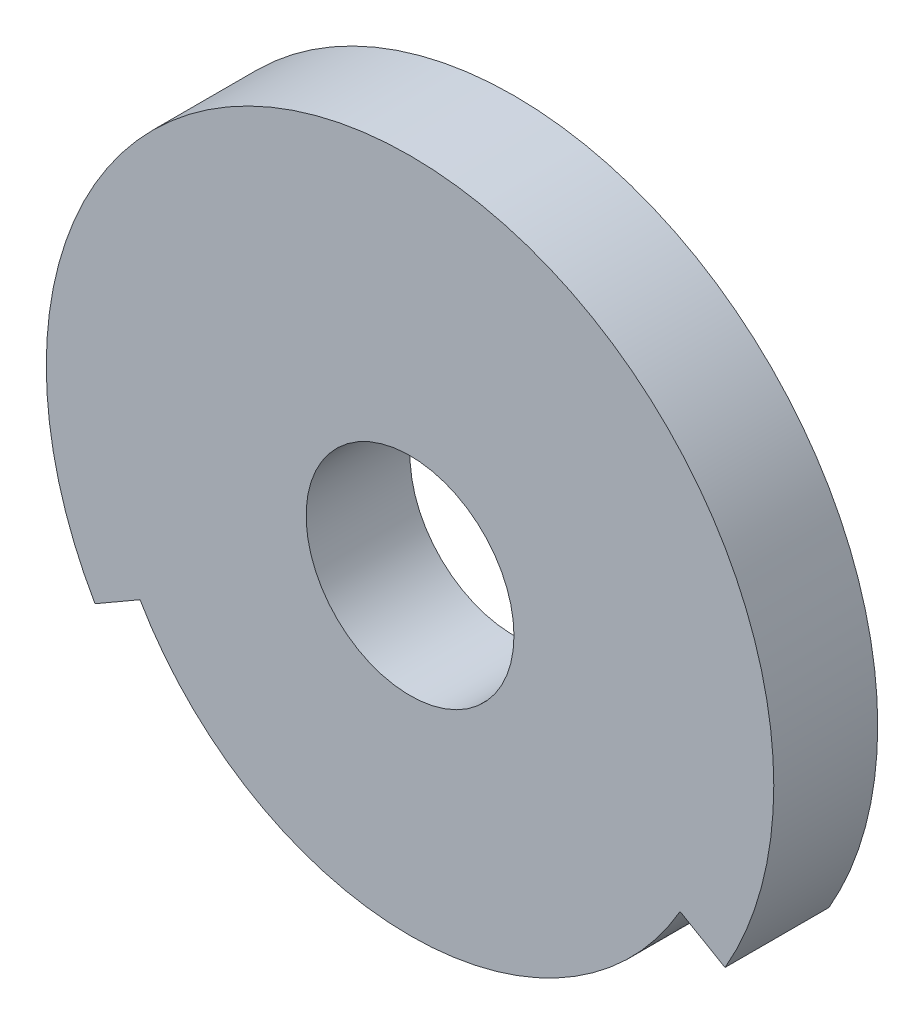
ISO-10303-21;
HEADER;
FILE_DESCRIPTION(('STEP AP214'),'2;1');
FILE_NAME('part.step','',(''),(''),'','','');
FILE_SCHEMA(('AUTOMOTIVE_DESIGN { 1 0 10303 214 1 1 1 1 }'));
ENDSEC;
DATA;
#1=APPLICATION_CONTEXT('core data for automotive mechanical design processes');
#2=APPLICATION_PROTOCOL_DEFINITION('international standard','automotive_design',2000,#1);
#3=PRODUCT_CONTEXT('',#1,'mechanical');
#4=PRODUCT('Part','Part','',(#3));
#5=PRODUCT_RELATED_PRODUCT_CATEGORY('part','',(#4));
#6=PRODUCT_DEFINITION_FORMATION('','',#4);
#7=PRODUCT_DEFINITION_CONTEXT('part definition',#1,'design');
#8=PRODUCT_DEFINITION('design','',#6,#7);
#9=PRODUCT_DEFINITION_SHAPE('','',#8);
#10=(LENGTH_UNIT() NAMED_UNIT(*) SI_UNIT(.MILLI.,.METRE.));
#11=(NAMED_UNIT(*) PLANE_ANGLE_UNIT() SI_UNIT($,.RADIAN.));
#12=(NAMED_UNIT(*) SI_UNIT($,.STERADIAN.) SOLID_ANGLE_UNIT());
#13=UNCERTAINTY_MEASURE_WITH_UNIT(LENGTH_MEASURE(1.E-05),#10,'distance_accuracy_value','');
#14=(GEOMETRIC_REPRESENTATION_CONTEXT(3) GLOBAL_UNCERTAINTY_ASSIGNED_CONTEXT((#13)) GLOBAL_UNIT_ASSIGNED_CONTEXT((#10,
#11,#12)) REPRESENTATION_CONTEXT('',''));
#15=CARTESIAN_POINT('',(0.,0.,0.));
#16=DIRECTION('',(0.,0.,1.));
#17=DIRECTION('',(1.,0.,0.));
#18=AXIS2_PLACEMENT_3D('',#15,#16,#17);
#19=CARTESIAN_POINT('',(0.,0.,1.));
#20=DIRECTION('',(0.,0.,-1.));
#21=DIRECTION('',(-1.,0.,0.));
#22=AXIS2_PLACEMENT_3D('',#19,#20,#21);
#23=CYLINDRICAL_SURFACE('',#22,3.5);
#24=CARTESIAN_POINT('',(0.,0.,0.));
#25=DIRECTION('',(0.,0.,-1.));
#26=DIRECTION('',(-1.,0.,0.));
#27=AXIS2_PLACEMENT_3D('',#24,#25,#26);
#28=CIRCLE('',#27,3.5);
#29=CARTESIAN_POINT('',(-3.03108891324554,-1.75,0.));
#30=VERTEX_POINT('',#29);
#31=CARTESIAN_POINT('',(3.03108891324553,-1.75,0.));
#32=VERTEX_POINT('',#31);
#33=EDGE_CURVE('E97',#30,#32,#28,.T.);
#34=ORIENTED_EDGE('',*,*,#33,.F.);
#35=DIRECTION('',(0.,0.,-1.));
#36=VECTOR('',#35,1.);
#37=CARTESIAN_POINT('',(-3.03108891324554,-1.75,1.));
#38=LINE('',#37,#36);
#39=CARTESIAN_POINT('',(-3.03108891324554,-1.75,1.));
#40=VERTEX_POINT('',#39);
#41=EDGE_CURVE('E11',#40,#30,#38,.T.);
#42=ORIENTED_EDGE('',*,*,#41,.F.);
#43=CARTESIAN_POINT('',(0.,0.,1.));
#44=DIRECTION('',(0.,0.,-1.));
#45=DIRECTION('',(-1.,0.,0.));
#46=AXIS2_PLACEMENT_3D('',#43,#44,#45);
#47=CIRCLE('',#46,3.5);
#48=CARTESIAN_POINT('',(3.03108891324553,-1.75,1.));
#49=VERTEX_POINT('',#48);
#50=EDGE_CURVE('E90',#40,#49,#47,.T.);
#51=ORIENTED_EDGE('',*,*,#50,.T.);
#52=DIRECTION('',(0.,0.,-1.));
#53=VECTOR('',#52,1.);
#54=CARTESIAN_POINT('',(3.03108891324553,-1.75,1.));
#55=LINE('',#54,#53);
#56=EDGE_CURVE('E35',#49,#32,#55,.T.);
#57=ORIENTED_EDGE('',*,*,#56,.T.);
#58=EDGE_LOOP('',(#34,#42,#51,#57));
#59=FACE_BOUND('',#58,.T.);
#60=ADVANCED_FACE('F32',(#59),#23,.T.);
#61=CARTESIAN_POINT('',(-2.59807621135332,-1.5,1.));
#62=DIRECTION('',(0.499999999999999,-0.866025403784439,0.));
#63=DIRECTION('',(0.866025403784439,0.499999999999999,0.));
#64=AXIS2_PLACEMENT_3D('',#61,#62,#63);
#65=PLANE('',#64);
#66=DIRECTION('',(-0.866025403784439,-0.499999999999999,0.));
#67=VECTOR('',#66,1.);
#68=CARTESIAN_POINT('',(-2.59807621135332,-1.5,0.));
#69=LINE('',#68,#67);
#70=CARTESIAN_POINT('',(-2.59807621135331,-1.5,0.));
#71=VERTEX_POINT('',#70);
#72=EDGE_CURVE('E92',#71,#30,#69,.T.);
#73=ORIENTED_EDGE('',*,*,#72,.F.);
#74=DIRECTION('',(0.,0.,-1.));
#75=VECTOR('',#74,1.);
#76=CARTESIAN_POINT('',(-2.59807621135331,-1.5,1.));
#77=LINE('',#76,#75);
#78=CARTESIAN_POINT('',(-2.59807621135331,-1.5,1.));
#79=VERTEX_POINT('',#78);
#80=EDGE_CURVE('E41',#79,#71,#77,.T.);
#81=ORIENTED_EDGE('',*,*,#80,.F.);
#82=DIRECTION('',(-0.866025403784439,-0.499999999999999,0.));
#83=VECTOR('',#82,1.);
#84=CARTESIAN_POINT('',(-2.59807621135332,-1.5,1.));
#85=LINE('',#84,#83);
#86=EDGE_CURVE('E87',#79,#40,#85,.T.);
#87=ORIENTED_EDGE('',*,*,#86,.T.);
#88=ORIENTED_EDGE('',*,*,#41,.T.);
#89=EDGE_LOOP('',(#73,#81,#87,#88));
#90=FACE_BOUND('',#89,.T.);
#91=ADVANCED_FACE('F108',(#90),#65,.T.);
#92=CARTESIAN_POINT('',(0.,0.,1.));
#93=DIRECTION('',(0.,0.,-1.));
#94=DIRECTION('',(-1.,0.,0.));
#95=AXIS2_PLACEMENT_3D('',#92,#93,#94);
#96=CYLINDRICAL_SURFACE('',#95,3.);
#97=CARTESIAN_POINT('',(0.,0.,0.));
#98=DIRECTION('',(0.,0.,-1.));
#99=DIRECTION('',(-1.,0.,0.));
#100=AXIS2_PLACEMENT_3D('',#97,#98,#99);
#101=CIRCLE('',#100,3.);
#102=CARTESIAN_POINT('',(2.59807621135331,-1.5,0.));
#103=VERTEX_POINT('',#102);
#104=EDGE_CURVE('E82',#103,#71,#101,.T.);
#105=ORIENTED_EDGE('',*,*,#104,.F.);
#106=DIRECTION('',(0.,0.,-1.));
#107=VECTOR('',#106,1.);
#108=CARTESIAN_POINT('',(2.59807621135331,-1.5,1.));
#109=LINE('',#108,#107);
#110=CARTESIAN_POINT('',(2.59807621135331,-1.5,1.));
#111=VERTEX_POINT('',#110);
#112=EDGE_CURVE('E77',#111,#103,#109,.T.);
#113=ORIENTED_EDGE('',*,*,#112,.F.);
#114=CARTESIAN_POINT('',(0.,0.,1.));
#115=DIRECTION('',(0.,0.,-1.));
#116=DIRECTION('',(-1.,0.,0.));
#117=AXIS2_PLACEMENT_3D('',#114,#115,#116);
#118=CIRCLE('',#117,3.);
#119=EDGE_CURVE('E80',#111,#79,#118,.T.);
#120=ORIENTED_EDGE('',*,*,#119,.T.);
#121=ORIENTED_EDGE('',*,*,#80,.T.);
#122=EDGE_LOOP('',(#105,#113,#120,#121));
#123=FACE_BOUND('',#122,.T.);
#124=ADVANCED_FACE('F79',(#123),#96,.T.);
#125=CARTESIAN_POINT('',(3.03108891324553,-1.75,1.));
#126=DIRECTION('',(-0.500000000000003,-0.866025403784437,0.));
#127=DIRECTION('',(0.866025403784437,-0.500000000000003,0.));
#128=AXIS2_PLACEMENT_3D('',#125,#126,#127);
#129=PLANE('',#128);
#130=DIRECTION('',(-0.866025403784437,0.500000000000003,0.));
#131=VECTOR('',#130,1.);
#132=CARTESIAN_POINT('',(3.03108891324553,-1.75,0.));
#133=LINE('',#132,#131);
#134=EDGE_CURVE('E100',#32,#103,#133,.T.);
#135=ORIENTED_EDGE('',*,*,#134,.F.);
#136=ORIENTED_EDGE('',*,*,#56,.F.);
#137=DIRECTION('',(-0.866025403784437,0.500000000000003,0.));
#138=VECTOR('',#137,1.);
#139=CARTESIAN_POINT('',(3.03108891324553,-1.75,1.));
#140=LINE('',#139,#138);
#141=EDGE_CURVE('E86',#49,#111,#140,.T.);
#142=ORIENTED_EDGE('',*,*,#141,.T.);
#143=ORIENTED_EDGE('',*,*,#112,.T.);
#144=EDGE_LOOP('',(#135,#136,#142,#143));
#145=FACE_BOUND('',#144,.T.);
#146=ADVANCED_FACE('F89',(#145),#129,.T.);
#147=CARTESIAN_POINT('',(0.,0.,1.));
#148=DIRECTION('',(0.,0.,-1.));
#149=DIRECTION('',(-1.,0.,0.));
#150=AXIS2_PLACEMENT_3D('',#147,#148,#149);
#151=PLANE('',#150);
#152=CARTESIAN_POINT('',(0.,0.,1.));
#153=DIRECTION('',(0.,0.,-1.));
#154=DIRECTION('',(1.,0.,0.));
#155=AXIS2_PLACEMENT_3D('',#152,#153,#154);
#156=CIRCLE('',#155,1.);
#157=CARTESIAN_POINT('',(1.,0.,1.));
#158=VERTEX_POINT('',#157);
#159=EDGE_CURVE('E101',#158,#158,#156,.T.);
#160=ORIENTED_EDGE('',*,*,#159,.T.);
#161=EDGE_LOOP('',(#160));
#162=FACE_BOUND('',#161,.T.);
#163=ORIENTED_EDGE('',*,*,#50,.F.);
#164=ORIENTED_EDGE('',*,*,#86,.F.);
#165=ORIENTED_EDGE('',*,*,#119,.F.);
#166=ORIENTED_EDGE('',*,*,#141,.F.);
#167=EDGE_LOOP('',(#163,#164,#165,#166));
#168=FACE_BOUND('',#167,.T.);
#169=ADVANCED_FACE('F85',(#162,#168),#151,.F.);
#170=CARTESIAN_POINT('',(0.,0.,0.));
#171=DIRECTION('',(0.,0.,-1.));
#172=DIRECTION('',(-1.,0.,0.));
#173=AXIS2_PLACEMENT_3D('',#170,#171,#172);
#174=PLANE('',#173);
#175=CARTESIAN_POINT('',(0.,0.,0.));
#176=DIRECTION('',(0.,0.,-1.));
#177=DIRECTION('',(1.,0.,0.));
#178=AXIS2_PLACEMENT_3D('',#175,#176,#177);
#179=CIRCLE('',#178,1.);
#180=CARTESIAN_POINT('',(1.,0.,0.));
#181=VERTEX_POINT('',#180);
#182=EDGE_CURVE('E138',#181,#181,#179,.T.);
#183=ORIENTED_EDGE('',*,*,#182,.F.);
#184=EDGE_LOOP('',(#183));
#185=FACE_BOUND('',#184,.T.);
#186=ORIENTED_EDGE('',*,*,#33,.T.);
#187=ORIENTED_EDGE('',*,*,#134,.T.);
#188=ORIENTED_EDGE('',*,*,#104,.T.);
#189=ORIENTED_EDGE('',*,*,#72,.T.);
#190=EDGE_LOOP('',(#186,#187,#188,#189));
#191=FACE_BOUND('',#190,.T.);
#192=ADVANCED_FACE('F107',(#185,#191),#174,.T.);
#193=CARTESIAN_POINT('',(0.,0.,1.));
#194=DIRECTION('',(0.,0.,-1.));
#195=DIRECTION('',(-1.,0.,0.));
#196=AXIS2_PLACEMENT_3D('',#193,#194,#195);
#197=CYLINDRICAL_SURFACE('',#196,1.);
#198=ORIENTED_EDGE('',*,*,#159,.F.);
#199=EDGE_LOOP('',(#198));
#200=FACE_BOUND('',#199,.T.);
#201=ORIENTED_EDGE('',*,*,#182,.T.);
#202=EDGE_LOOP('',(#201));
#203=FACE_BOUND('',#202,.T.);
#204=ADVANCED_FACE('F126',(#200,#203),#197,.F.);
#205=CLOSED_SHELL('',(#60,#91,#124,#146,#169,#192,#204));
#206=MANIFOLD_SOLID_BREP('B2',#205);
#207=ADVANCED_BREP_SHAPE_REPRESENTATION('',(#18,#206),#14);
#208=SHAPE_DEFINITION_REPRESENTATION(#9,#207);
ENDSEC;
END-ISO-10303-21;
